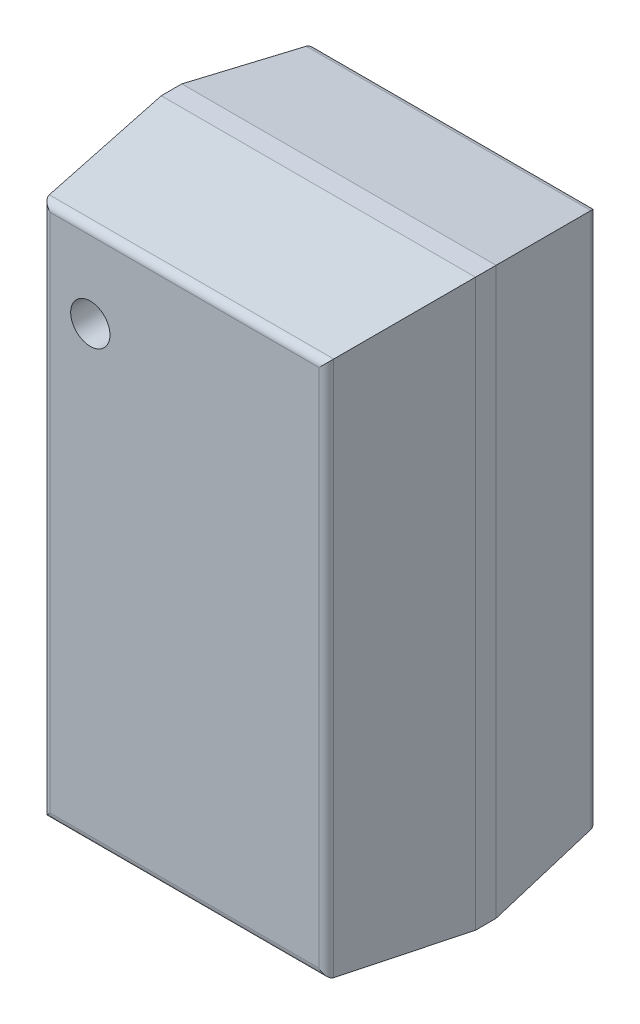
ISO-10303-21;
HEADER;
FILE_DESCRIPTION(('STEP AP214'),'2;1');
FILE_NAME('part.step','',(''),(''),'','','');
FILE_SCHEMA(('AUTOMOTIVE_DESIGN { 1 0 10303 214 1 1 1 1 }'));
ENDSEC;
DATA;
#1=APPLICATION_CONTEXT('core data for automotive mechanical design processes');
#2=APPLICATION_PROTOCOL_DEFINITION('international standard','automotive_design',2000,#1);
#3=PRODUCT_CONTEXT('',#1,'mechanical');
#4=PRODUCT('Part','Part','',(#3));
#5=PRODUCT_RELATED_PRODUCT_CATEGORY('part','',(#4));
#6=PRODUCT_DEFINITION_FORMATION('','',#4);
#7=PRODUCT_DEFINITION_CONTEXT('part definition',#1,'design');
#8=PRODUCT_DEFINITION('design','',#6,#7);
#9=PRODUCT_DEFINITION_SHAPE('','',#8);
#10=(LENGTH_UNIT() NAMED_UNIT(*) SI_UNIT(.MILLI.,.METRE.));
#11=(NAMED_UNIT(*) PLANE_ANGLE_UNIT() SI_UNIT($,.RADIAN.));
#12=(NAMED_UNIT(*) SI_UNIT($,.STERADIAN.) SOLID_ANGLE_UNIT());
#13=UNCERTAINTY_MEASURE_WITH_UNIT(LENGTH_MEASURE(1.E-05),#10,'distance_accuracy_value','');
#14=(GEOMETRIC_REPRESENTATION_CONTEXT(3) GLOBAL_UNCERTAINTY_ASSIGNED_CONTEXT((#13)) GLOBAL_UNIT_ASSIGNED_CONTEXT((#10,
#11,#12)) REPRESENTATION_CONTEXT('',''));
#15=CARTESIAN_POINT('',(0.,0.,0.));
#16=DIRECTION('',(0.,0.,1.));
#17=DIRECTION('',(1.,0.,0.));
#18=AXIS2_PLACEMENT_3D('',#15,#16,#17);
#19=CARTESIAN_POINT('',(-0.4875,0.95,1.305));
#20=DIRECTION('',(0.,0.,1.));
#21=DIRECTION('',(1.,0.,0.));
#22=AXIS2_PLACEMENT_3D('',#19,#20,#21);
#23=PLANE('',#22);
#24=CARTESIAN_POINT('',(-0.4875,0.95,1.305));
#25=DIRECTION('',(0.,0.,1.));
#26=DIRECTION('',(1.,0.,0.));
#27=AXIS2_PLACEMENT_3D('',#24,#25,#26);
#28=CIRCLE('',#27,0.1015625);
#29=CARTESIAN_POINT('',(-0.3859375,0.95,1.305));
#30=VERTEX_POINT('',#29);
#31=EDGE_CURVE('E20',#30,#30,#28,.T.);
#32=ORIENTED_EDGE('',*,*,#31,.T.);
#33=EDGE_LOOP('',(#32));
#34=FACE_BOUND('',#33,.T.);
#35=ADVANCED_FACE('F17',(#34),#23,.T.);
#36=CARTESIAN_POINT('',(-0.4875,0.95,1.305));
#37=DIRECTION('',(0.,0.,1.));
#38=DIRECTION('',(1.,0.,0.));
#39=AXIS2_PLACEMENT_3D('',#36,#37,#38);
#40=CYLINDRICAL_SURFACE('',#39,0.1015625);
#41=CARTESIAN_POINT('',(-0.4875,0.95,1.45));
#42=DIRECTION('',(0.,0.,1.));
#43=DIRECTION('',(1.,0.,0.));
#44=AXIS2_PLACEMENT_3D('',#41,#42,#43);
#45=CIRCLE('',#44,0.1015625);
#46=CARTESIAN_POINT('',(-0.3859375,0.95,1.45));
#47=VERTEX_POINT('',#46);
#48=EDGE_CURVE('E100',#47,#47,#45,.F.);
#49=ORIENTED_EDGE('',*,*,#48,.F.);
#50=EDGE_LOOP('',(#49));
#51=FACE_BOUND('',#50,.T.);
#52=ORIENTED_EDGE('',*,*,#31,.F.);
#53=EDGE_LOOP('',(#52));
#54=FACE_BOUND('',#53,.T.);
#55=ADVANCED_FACE('F496',(#51,#54),#40,.F.);
#56=CARTESIAN_POINT('',(-0.8125,-1.4625,1.45));
#57=DIRECTION('',(0.,0.,1.));
#58=DIRECTION('',(1.,0.,0.));
#59=AXIS2_PLACEMENT_3D('',#56,#57,#58);
#60=PLANE('',#59);
#61=ORIENTED_EDGE('',*,*,#48,.T.);
#62=EDGE_LOOP('',(#61));
#63=FACE_BOUND('',#62,.T.);
#64=DIRECTION('',(0.,1.,0.));
#65=VECTOR('',#64,1.);
#66=CARTESIAN_POINT('',(0.695116313681,-1.38125,1.45));
#67=LINE('',#66,#65);
#68=CARTESIAN_POINT('',(0.695116313681,1.345116313681,1.45));
#69=VERTEX_POINT('',#68);
#70=CARTESIAN_POINT('',(0.695116313681,-1.345116313681,1.45));
#71=VERTEX_POINT('',#70);
#72=EDGE_CURVE('E107',#69,#71,#67,.F.);
#73=ORIENTED_EDGE('',*,*,#72,.F.);
#74=DIRECTION('',(1.,0.,0.));
#75=VECTOR('',#74,1.);
#76=CARTESIAN_POINT('',(-0.8125,1.345116313681,1.45));
#77=LINE('',#76,#75);
#78=CARTESIAN_POINT('',(-0.695116313681,1.345116313681,1.45));
#79=VERTEX_POINT('',#78);
#80=EDGE_CURVE('E96',#69,#79,#77,.F.);
#81=ORIENTED_EDGE('',*,*,#80,.T.);
#82=DIRECTION('',(0.,1.,0.));
#83=VECTOR('',#82,1.);
#84=CARTESIAN_POINT('',(-0.695116313681,-1.38125,1.45));
#85=LINE('',#84,#83);
#86=CARTESIAN_POINT('',(-0.695116313681,-1.345116313681,1.45));
#87=VERTEX_POINT('',#86);
#88=EDGE_CURVE('E92',#87,#79,#85,.T.);
#89=ORIENTED_EDGE('',*,*,#88,.F.);
#90=DIRECTION('',(1.,0.,0.));
#91=VECTOR('',#90,1.);
#92=CARTESIAN_POINT('',(-0.73125,-1.345116313681,1.45));
#93=LINE('',#92,#91);
#94=EDGE_CURVE('E81',#71,#87,#93,.F.);
#95=ORIENTED_EDGE('',*,*,#94,.F.);
#96=EDGE_LOOP('',(#73,#81,#89,#95));
#97=FACE_BOUND('',#96,.T.);
#98=ADVANCED_FACE('F95',(#63,#97),#60,.T.);
#99=CARTESIAN_POINT('',(-0.695116313681,-1.38125,1.409375));
#100=DIRECTION('',(0.,1.,0.));
#101=DIRECTION('',(0.,0.,1.));
#102=AXIS2_PLACEMENT_3D('',#99,#100,#101);
#103=CYLINDRICAL_SURFACE('',#102,0.040625);
#104=CARTESIAN_POINT('',(-0.695116313681,1.345116313681,1.409375));
#105=DIRECTION('',(0.707106781186547,0.707106781186547,0.));
#106=DIRECTION('',(0.707106781186547,-0.707106781186547,0.));
#107=AXIS2_PLACEMENT_3D('',#104,#105,#106);
#108=ELLIPSE('',#107,0.057452425971407,0.040625);
#109=CARTESIAN_POINT('',(-0.735464089736969,1.38546408973693,1.41411288901713));
#110=VERTEX_POINT('',#109);
#111=EDGE_CURVE('E129',#110,#79,#108,.T.);
#112=ORIENTED_EDGE('',*,*,#111,.F.);
#113=DIRECTION('',(0.,1.,0.));
#114=VECTOR('',#113,1.);
#115=CARTESIAN_POINT('',(-0.735464089736921,-1.4625,1.41411288901699));
#116=LINE('',#115,#114);
#117=CARTESIAN_POINT('',(-0.735464089736969,-1.38546408973693,1.41411288901713));
#118=VERTEX_POINT('',#117);
#119=EDGE_CURVE('E104',#110,#118,#116,.F.);
#120=ORIENTED_EDGE('',*,*,#119,.T.);
#121=CARTESIAN_POINT('',(-0.695116313681,-1.345116313681,1.409375));
#122=DIRECTION('',(0.707106781186547,-0.707106781186547,0.));
#123=DIRECTION('',(0.707106781186547,0.707106781186547,0.));
#124=AXIS2_PLACEMENT_3D('',#121,#122,#123);
#125=ELLIPSE('',#124,0.057452425971407,0.040625);
#126=EDGE_CURVE('E86',#87,#118,#125,.T.);
#127=ORIENTED_EDGE('',*,*,#126,.F.);
#128=ORIENTED_EDGE('',*,*,#88,.T.);
#129=EDGE_LOOP('',(#112,#120,#127,#128));
#130=FACE_BOUND('',#129,.T.);
#131=ADVANCED_FACE('F103',(#130),#103,.T.);
#132=CARTESIAN_POINT('',(-0.73125,-1.345116313681,1.409375));
#133=DIRECTION('',(1.,0.,0.));
#134=DIRECTION('',(0.,0.,-1.));
#135=AXIS2_PLACEMENT_3D('',#132,#133,#134);
#136=CYLINDRICAL_SURFACE('',#135,0.040625);
#137=ORIENTED_EDGE('',*,*,#94,.T.);
#138=ORIENTED_EDGE('',*,*,#126,.T.);
#139=DIRECTION('',(1.,0.,0.));
#140=VECTOR('',#139,1.);
#141=CARTESIAN_POINT('',(-0.8125,-1.38546408973692,1.41411288901699));
#142=LINE('',#141,#140);
#143=CARTESIAN_POINT('',(0.735464089736929,-1.38546408973697,1.41411288901713));
#144=VERTEX_POINT('',#143);
#145=EDGE_CURVE('E141',#118,#144,#142,.T.);
#146=ORIENTED_EDGE('',*,*,#145,.T.);
#147=CARTESIAN_POINT('',(0.695116313681,-1.345116313681,1.409375));
#148=DIRECTION('',(0.707106781186547,0.707106781186547,0.));
#149=DIRECTION('',(-0.707106781186547,0.707106781186547,0.));
#150=AXIS2_PLACEMENT_3D('',#147,#148,#149);
#151=ELLIPSE('',#150,0.057452425971407,0.040625);
#152=EDGE_CURVE('E88',#71,#144,#151,.T.);
#153=ORIENTED_EDGE('',*,*,#152,.F.);
#154=EDGE_LOOP('',(#137,#138,#146,#153));
#155=FACE_BOUND('',#154,.T.);
#156=ADVANCED_FACE('F83',(#155),#136,.T.);
#157=CARTESIAN_POINT('',(0.695116313681,-1.38125,1.409375));
#158=DIRECTION('',(0.,1.,0.));
#159=DIRECTION('',(0.,0.,1.));
#160=AXIS2_PLACEMENT_3D('',#157,#158,#159);
#161=CYLINDRICAL_SURFACE('',#160,0.040625);
#162=CARTESIAN_POINT('',(0.695116313681,1.345116313681,1.409375));
#163=DIRECTION('',(0.707106781186547,-0.707106781186547,0.));
#164=DIRECTION('',(0.707106781186547,0.707106781186547,0.));
#165=AXIS2_PLACEMENT_3D('',#162,#163,#164);
#166=ELLIPSE('',#165,0.057452425971407,0.040625);
#167=CARTESIAN_POINT('',(0.735464089736969,1.38546408973693,1.41411288901713));
#168=VERTEX_POINT('',#167);
#169=EDGE_CURVE('E130',#69,#168,#166,.F.);
#170=ORIENTED_EDGE('',*,*,#169,.F.);
#171=ORIENTED_EDGE('',*,*,#72,.T.);
#172=ORIENTED_EDGE('',*,*,#152,.T.);
#173=DIRECTION('',(0.,1.,0.));
#174=VECTOR('',#173,1.);
#175=CARTESIAN_POINT('',(0.735464089736921,-1.4625,1.41411288901699));
#176=LINE('',#175,#174);
#177=EDGE_CURVE('E139',#168,#144,#176,.F.);
#178=ORIENTED_EDGE('',*,*,#177,.F.);
#179=EDGE_LOOP('',(#170,#171,#172,#178));
#180=FACE_BOUND('',#179,.T.);
#181=ADVANCED_FACE('F463',(#180),#161,.T.);
#182=CARTESIAN_POINT('',(-0.73125,1.345116313681,1.409375));
#183=DIRECTION('',(1.,0.,0.));
#184=DIRECTION('',(0.,0.,-1.));
#185=AXIS2_PLACEMENT_3D('',#182,#183,#184);
#186=CYLINDRICAL_SURFACE('',#185,0.040625);
#187=DIRECTION('',(1.,0.,0.));
#188=VECTOR('',#187,1.);
#189=CARTESIAN_POINT('',(-0.8125,1.38546408973692,1.41411288901699));
#190=LINE('',#189,#188);
#191=EDGE_CURVE('E149',#110,#168,#190,.T.);
#192=ORIENTED_EDGE('',*,*,#191,.F.);
#193=ORIENTED_EDGE('',*,*,#111,.T.);
#194=ORIENTED_EDGE('',*,*,#80,.F.);
#195=ORIENTED_EDGE('',*,*,#169,.T.);
#196=EDGE_LOOP('',(#192,#193,#194,#195));
#197=FACE_BOUND('',#196,.T.);
#198=ADVANCED_FACE('F453',(#197),#186,.T.);
#199=CARTESIAN_POINT('',(-0.771875,-1.4625,1.104038244395));
#200=DIRECTION('',(0.993176025992301,0.,-0.116624960425035));
#201=DIRECTION('',(-0.116624960425035,0.,-0.993176025992301));
#202=AXIS2_PLACEMENT_3D('',#199,#200,#201);
#203=PLANE('',#202);
#204=DIRECTION('',(0.115839830265898,-0.115839830265949,0.986489871943916));
#205=VECTOR('',#204,1.);
#206=CARTESIAN_POINT('',(-0.8125,1.46249999999996,0.758076488790995));
#207=LINE('',#206,#205);
#208=CARTESIAN_POINT('',(-0.8125,1.46249999999999,0.758076488790999));
#209=VERTEX_POINT('',#208);
#210=EDGE_CURVE('E155',#209,#110,#207,.T.);
#211=ORIENTED_EDGE('',*,*,#210,.F.);
#212=DIRECTION('',(0.,1.,0.));
#213=VECTOR('',#212,1.);
#214=CARTESIAN_POINT('',(-0.8125,-1.4625,0.758076488791));
#215=LINE('',#214,#213);
#216=CARTESIAN_POINT('',(-0.8125,-1.46249999999999,0.758076488790999));
#217=VERTEX_POINT('',#216);
#218=EDGE_CURVE('E183',#209,#217,#215,.F.);
#219=ORIENTED_EDGE('',*,*,#218,.T.);
#220=DIRECTION('',(0.115839830265898,0.115839830265949,0.986489871943916));
#221=VECTOR('',#220,1.);
#222=CARTESIAN_POINT('',(-0.8125,-1.46249999999996,0.758076488790995));
#223=LINE('',#222,#221);
#224=EDGE_CURVE('E142',#217,#118,#223,.T.);
#225=ORIENTED_EDGE('',*,*,#224,.T.);
#226=ORIENTED_EDGE('',*,*,#119,.F.);
#227=EDGE_LOOP('',(#211,#219,#225,#226));
#228=FACE_BOUND('',#227,.T.);
#229=ADVANCED_FACE('F444',(#228),#203,.F.);
#230=CARTESIAN_POINT('',(-0.8125,-1.421875,1.104038244395));
#231=DIRECTION('',(0.,0.993176025992301,-0.116624960425035));
#232=DIRECTION('',(0.,0.116624960425035,0.993176025992301));
#233=AXIS2_PLACEMENT_3D('',#230,#231,#232);
#234=PLANE('',#233);
#235=DIRECTION('',(1.,0.,0.));
#236=VECTOR('',#235,1.);
#237=CARTESIAN_POINT('',(-0.8125,-1.4625,0.758076488791));
#238=LINE('',#237,#236);
#239=CARTESIAN_POINT('',(0.812499999999989,-1.4625,0.758076488790999));
#240=VERTEX_POINT('',#239);
#241=EDGE_CURVE('E170',#217,#240,#238,.T.);
#242=ORIENTED_EDGE('',*,*,#241,.T.);
#243=DIRECTION('',(0.115839830265948,-0.115839830265898,-0.986489871943916));
#244=VECTOR('',#243,1.);
#245=CARTESIAN_POINT('',(0.735464089736921,-1.385464089737,1.41411288901699));
#246=LINE('',#245,#244);
#247=EDGE_CURVE('E144',#144,#240,#246,.T.);
#248=ORIENTED_EDGE('',*,*,#247,.F.);
#249=ORIENTED_EDGE('',*,*,#145,.F.);
#250=ORIENTED_EDGE('',*,*,#224,.F.);
#251=EDGE_LOOP('',(#242,#248,#249,#250));
#252=FACE_BOUND('',#251,.T.);
#253=ADVANCED_FACE('F435',(#252),#234,.F.);
#254=CARTESIAN_POINT('',(0.771875,-1.4625,1.104038244395));
#255=DIRECTION('',(0.993176025992301,0.,0.116624960425035));
#256=DIRECTION('',(0.116624960425035,0.,-0.993176025992301));
#257=AXIS2_PLACEMENT_3D('',#254,#255,#256);
#258=PLANE('',#257);
#259=DIRECTION('',(0.115839830265898,0.115839830265949,-0.986489871943916));
#260=VECTOR('',#259,1.);
#261=CARTESIAN_POINT('',(0.735464089737001,1.38546408973692,1.41411288901699));
#262=LINE('',#261,#260);
#263=CARTESIAN_POINT('',(0.812500000000001,1.46249999999999,0.758076488790999));
#264=VERTEX_POINT('',#263);
#265=EDGE_CURVE('E150',#168,#264,#262,.T.);
#266=ORIENTED_EDGE('',*,*,#265,.F.);
#267=ORIENTED_EDGE('',*,*,#177,.T.);
#268=ORIENTED_EDGE('',*,*,#247,.T.);
#269=DIRECTION('',(0.,1.,0.));
#270=VECTOR('',#269,1.);
#271=CARTESIAN_POINT('',(0.8125,-1.4625,0.758076488791));
#272=LINE('',#271,#270);
#273=EDGE_CURVE('E180',#264,#240,#272,.F.);
#274=ORIENTED_EDGE('',*,*,#273,.F.);
#275=EDGE_LOOP('',(#266,#267,#268,#274));
#276=FACE_BOUND('',#275,.T.);
#277=ADVANCED_FACE('F426',(#276),#258,.T.);
#278=CARTESIAN_POINT('',(-0.8125,1.421875,1.104038244395));
#279=DIRECTION('',(0.,0.993176025992301,0.116624960425035));
#280=DIRECTION('',(0.,-0.116624960425035,0.993176025992301));
#281=AXIS2_PLACEMENT_3D('',#278,#279,#280);
#282=PLANE('',#281);
#283=DIRECTION('',(1.,0.,0.));
#284=VECTOR('',#283,1.);
#285=CARTESIAN_POINT('',(-0.8125,1.4625,0.758076488791));
#286=LINE('',#285,#284);
#287=EDGE_CURVE('E202',#209,#264,#286,.T.);
#288=ORIENTED_EDGE('',*,*,#287,.F.);
#289=ORIENTED_EDGE('',*,*,#210,.T.);
#290=ORIENTED_EDGE('',*,*,#191,.T.);
#291=ORIENTED_EDGE('',*,*,#265,.T.);
#292=EDGE_LOOP('',(#288,#289,#290,#291));
#293=FACE_BOUND('',#292,.T.);
#294=ADVANCED_FACE('F417',(#293),#282,.T.);
#295=CARTESIAN_POINT('',(-0.8125,-1.4625,0.05));
#296=DIRECTION('',(1.,0.,0.));
#297=DIRECTION('',(0.,0.,-1.));
#298=AXIS2_PLACEMENT_3D('',#295,#296,#297);
#299=PLANE('',#298);
#300=DIRECTION('',(0.,0.,1.));
#301=VECTOR('',#300,1.);
#302=CARTESIAN_POINT('',(-0.8125,1.4625,0.05));
#303=LINE('',#302,#301);
#304=CARTESIAN_POINT('',(-0.81250000000002,1.46250000000006,0.651826488790992));
#305=VERTEX_POINT('',#304);
#306=EDGE_CURVE('E206',#305,#209,#303,.T.);
#307=ORIENTED_EDGE('',*,*,#306,.F.);
#308=DIRECTION('',(0.,1.,0.));
#309=VECTOR('',#308,1.);
#310=CARTESIAN_POINT('',(-0.812500000000081,-1.4625,0.651826488790989));
#311=LINE('',#310,#309);
#312=CARTESIAN_POINT('',(-0.81250000000002,-1.46250000000004,0.651826488790992));
#313=VERTEX_POINT('',#312);
#314=EDGE_CURVE('E205',#313,#305,#311,.T.);
#315=ORIENTED_EDGE('',*,*,#314,.F.);
#316=DIRECTION('',(0.,0.,1.));
#317=VECTOR('',#316,1.);
#318=CARTESIAN_POINT('',(-0.8125,-1.4625,0.05));
#319=LINE('',#318,#317);
#320=EDGE_CURVE('E173',#313,#217,#319,.T.);
#321=ORIENTED_EDGE('',*,*,#320,.T.);
#322=ORIENTED_EDGE('',*,*,#218,.F.);
#323=EDGE_LOOP('',(#307,#315,#321,#322));
#324=FACE_BOUND('',#323,.T.);
#325=ADVANCED_FACE('F407',(#324),#299,.F.);
#326=CARTESIAN_POINT('',(-0.8125,-1.4625,0.05));
#327=DIRECTION('',(0.,1.,0.));
#328=DIRECTION('',(0.,0.,1.));
#329=AXIS2_PLACEMENT_3D('',#326,#327,#328);
#330=PLANE('',#329);
#331=ORIENTED_EDGE('',*,*,#320,.F.);
#332=DIRECTION('',(1.,0.,0.));
#333=VECTOR('',#332,1.);
#334=CARTESIAN_POINT('',(-0.8125,-1.46250000000008,0.651826488790989));
#335=LINE('',#334,#333);
#336=CARTESIAN_POINT('',(0.81250000000004,-1.46250000000002,0.651826488790989));
#337=VERTEX_POINT('',#336);
#338=EDGE_CURVE('E235',#337,#313,#335,.F.);
#339=ORIENTED_EDGE('',*,*,#338,.F.);
#340=DIRECTION('',(0.,0.,-1.));
#341=VECTOR('',#340,1.);
#342=CARTESIAN_POINT('',(0.8125,-1.4625,0.05));
#343=LINE('',#342,#341);
#344=EDGE_CURVE('E172',#240,#337,#343,.T.);
#345=ORIENTED_EDGE('',*,*,#344,.F.);
#346=ORIENTED_EDGE('',*,*,#241,.F.);
#347=EDGE_LOOP('',(#331,#339,#345,#346));
#348=FACE_BOUND('',#347,.T.);
#349=ADVANCED_FACE('F398',(#348),#330,.F.);
#350=CARTESIAN_POINT('',(0.8125,-1.4625,0.05));
#351=DIRECTION('',(1.,0.,0.));
#352=DIRECTION('',(0.,0.,-1.));
#353=AXIS2_PLACEMENT_3D('',#350,#351,#352);
#354=PLANE('',#353);
#355=DIRECTION('',(0.,0.,1.));
#356=VECTOR('',#355,1.);
#357=CARTESIAN_POINT('',(0.8125,1.4625,0.05));
#358=LINE('',#357,#356);
#359=CARTESIAN_POINT('',(0.81250000000002,1.46250000000004,0.651826488790989));
#360=VERTEX_POINT('',#359);
#361=EDGE_CURVE('E210',#264,#360,#358,.F.);
#362=ORIENTED_EDGE('',*,*,#361,.F.);
#363=ORIENTED_EDGE('',*,*,#273,.T.);
#364=ORIENTED_EDGE('',*,*,#344,.T.);
#365=DIRECTION('',(0.,1.,0.));
#366=VECTOR('',#365,1.);
#367=CARTESIAN_POINT('',(0.812500000000081,-1.4625,0.651826488790989));
#368=LINE('',#367,#366);
#369=EDGE_CURVE('E228',#337,#360,#368,.T.);
#370=ORIENTED_EDGE('',*,*,#369,.T.);
#371=EDGE_LOOP('',(#362,#363,#364,#370));
#372=FACE_BOUND('',#371,.T.);
#373=ADVANCED_FACE('F389',(#372),#354,.T.);
#374=CARTESIAN_POINT('',(-0.8125,1.4625,0.05));
#375=DIRECTION('',(0.,1.,0.));
#376=DIRECTION('',(0.,0.,1.));
#377=AXIS2_PLACEMENT_3D('',#374,#375,#376);
#378=PLANE('',#377);
#379=ORIENTED_EDGE('',*,*,#306,.T.);
#380=ORIENTED_EDGE('',*,*,#287,.T.);
#381=ORIENTED_EDGE('',*,*,#361,.T.);
#382=DIRECTION('',(1.,0.,0.));
#383=VECTOR('',#382,1.);
#384=CARTESIAN_POINT('',(-0.8125,1.46250000000008,0.651826488790989));
#385=LINE('',#384,#383);
#386=EDGE_CURVE('E254',#360,#305,#385,.F.);
#387=ORIENTED_EDGE('',*,*,#386,.T.);
#388=EDGE_LOOP('',(#379,#380,#381,#387));
#389=FACE_BOUND('',#388,.T.);
#390=ADVANCED_FACE('F380',(#389),#378,.T.);
#391=CARTESIAN_POINT('',(-0.771875,-1.4625,0.350913244395));
#392=DIRECTION('',(-0.991009446911636,0.,-0.133791913551951));
#393=DIRECTION('',(-0.133791913551951,0.,0.991009446911636));
#394=AXIS2_PLACEMENT_3D('',#391,#392,#393);
#395=PLANE('',#394);
#396=DIRECTION('',(0.132610297441193,-0.132610297440669,-0.982257103830385));
#397=VECTOR('',#396,1.);
#398=CARTESIAN_POINT('',(-0.8125,1.46250000000008,0.651826488790989));
#399=LINE('',#398,#397);
#400=CARTESIAN_POINT('',(-0.736000810181392,1.38600081018168,0.0851897035119067));
#401=VERTEX_POINT('',#400);
#402=EDGE_CURVE('E256',#305,#401,#399,.T.);
#403=ORIENTED_EDGE('',*,*,#402,.T.);
#404=DIRECTION('',(0.,1.,0.));
#405=VECTOR('',#404,1.);
#406=CARTESIAN_POINT('',(-0.736000810181771,-1.38125,0.0851897035118459));
#407=LINE('',#406,#405);
#408=CARTESIAN_POINT('',(-0.736000810181392,-1.38600081018168,0.0851897035119067));
#409=VERTEX_POINT('',#408);
#410=EDGE_CURVE('E128',#409,#401,#407,.T.);
#411=ORIENTED_EDGE('',*,*,#410,.F.);
#412=DIRECTION('',(0.132610297441193,0.132610297440669,-0.982257103830385));
#413=VECTOR('',#412,1.);
#414=CARTESIAN_POINT('',(-0.8125,-1.46250000000008,0.651826488790989));
#415=LINE('',#414,#413);
#416=EDGE_CURVE('E237',#313,#409,#415,.T.);
#417=ORIENTED_EDGE('',*,*,#416,.F.);
#418=ORIENTED_EDGE('',*,*,#314,.T.);
#419=EDGE_LOOP('',(#403,#411,#417,#418));
#420=FACE_BOUND('',#419,.T.);
#421=ADVANCED_FACE('F301',(#420),#395,.T.);
#422=CARTESIAN_POINT('',(-0.8125,-1.421875,0.350913244395));
#423=DIRECTION('',(0.,-0.991009446911636,-0.133791913551951));
#424=DIRECTION('',(0.,0.133791913551951,-0.991009446911636));
#425=AXIS2_PLACEMENT_3D('',#422,#423,#424);
#426=PLANE('',#425);
#427=ORIENTED_EDGE('',*,*,#338,.T.);
#428=ORIENTED_EDGE('',*,*,#416,.T.);
#429=DIRECTION('',(1.,0.,0.));
#430=VECTOR('',#429,1.);
#431=CARTESIAN_POINT('',(-0.73125,-1.38600081018177,0.0851897035118459));
#432=LINE('',#431,#430);
#433=CARTESIAN_POINT('',(0.73600081018168,-1.38600081018139,0.0851897035119068));
#434=VERTEX_POINT('',#433);
#435=EDGE_CURVE('E127',#434,#409,#432,.F.);
#436=ORIENTED_EDGE('',*,*,#435,.F.);
#437=DIRECTION('',(0.132610297440669,-0.132610297441193,0.982257103830385));
#438=VECTOR('',#437,1.);
#439=CARTESIAN_POINT('',(0.736000810181383,-1.386000810181,0.0851897035118983));
#440=LINE('',#439,#438);
#441=EDGE_CURVE('E231',#434,#337,#440,.T.);
#442=ORIENTED_EDGE('',*,*,#441,.T.);
#443=EDGE_LOOP('',(#427,#428,#436,#442));
#444=FACE_BOUND('',#443,.T.);
#445=ADVANCED_FACE('F275',(#444),#426,.T.);
#446=CARTESIAN_POINT('',(0.771875,-1.4625,0.350913244395));
#447=DIRECTION('',(-0.991009446911636,0.,0.133791913551951));
#448=DIRECTION('',(0.133791913551951,0.,0.991009446911636));
#449=AXIS2_PLACEMENT_3D('',#446,#447,#448);
#450=PLANE('',#449);
#451=DIRECTION('',(0.132610297441193,0.132610297440669,0.982257103830385));
#452=VECTOR('',#451,1.);
#453=CARTESIAN_POINT('',(0.736000810181,1.38600081018138,0.0851897035118983));
#454=LINE('',#453,#452);
#455=CARTESIAN_POINT('',(0.736000810181392,1.38600081018168,0.0851897035119067));
#456=VERTEX_POINT('',#455);
#457=EDGE_CURVE('E230',#456,#360,#454,.T.);
#458=ORIENTED_EDGE('',*,*,#457,.T.);
#459=ORIENTED_EDGE('',*,*,#369,.F.);
#460=ORIENTED_EDGE('',*,*,#441,.F.);
#461=DIRECTION('',(0.,1.,0.));
#462=VECTOR('',#461,1.);
#463=CARTESIAN_POINT('',(0.736000810181771,-1.38125,0.0851897035118459));
#464=LINE('',#463,#462);
#465=EDGE_CURVE('E124',#456,#434,#464,.F.);
#466=ORIENTED_EDGE('',*,*,#465,.F.);
#467=EDGE_LOOP('',(#458,#459,#460,#466));
#468=FACE_BOUND('',#467,.T.);
#469=ADVANCED_FACE('F280',(#468),#450,.F.);
#470=CARTESIAN_POINT('',(-0.8125,1.421875,0.350913244395));
#471=DIRECTION('',(0.,-0.991009446911636,0.133791913551951));
#472=DIRECTION('',(0.,-0.133791913551951,-0.991009446911636));
#473=AXIS2_PLACEMENT_3D('',#470,#471,#472);
#474=PLANE('',#473);
#475=ORIENTED_EDGE('',*,*,#386,.F.);
#476=ORIENTED_EDGE('',*,*,#457,.F.);
#477=DIRECTION('',(1.,0.,0.));
#478=VECTOR('',#477,1.);
#479=CARTESIAN_POINT('',(-0.73125,1.38600081018177,0.0851897035118459));
#480=LINE('',#479,#478);
#481=EDGE_CURVE('E118',#401,#456,#480,.T.);
#482=ORIENTED_EDGE('',*,*,#481,.F.);
#483=ORIENTED_EDGE('',*,*,#402,.F.);
#484=EDGE_LOOP('',(#475,#476,#482,#483));
#485=FACE_BOUND('',#484,.T.);
#486=ADVANCED_FACE('F303',(#485),#474,.F.);
#487=CARTESIAN_POINT('',(-0.695741051401,-1.38125,0.090625));
#488=DIRECTION('',(0.,1.,0.));
#489=DIRECTION('',(0.,0.,1.));
#490=AXIS2_PLACEMENT_3D('',#487,#488,#489);
#491=CYLINDRICAL_SURFACE('',#490,0.040625);
#492=DIRECTION('',(0.,1.,0.));
#493=VECTOR('',#492,1.);
#494=CARTESIAN_POINT('',(-0.695741051401,-1.4625,0.05));
#495=LINE('',#494,#493);
#496=CARTESIAN_POINT('',(-0.695741051401,1.345741051401,0.05));
#497=VERTEX_POINT('',#496);
#498=CARTESIAN_POINT('',(-0.695741051401,-1.345741051401,0.05));
#499=VERTEX_POINT('',#498);
#500=EDGE_CURVE('E117',#497,#499,#495,.F.);
#501=ORIENTED_EDGE('',*,*,#500,.T.);
#502=CARTESIAN_POINT('',(-0.695741051401,-1.345741051401,0.090625));
#503=DIRECTION('',(0.707106781186547,-0.707106781186547,0.));
#504=DIRECTION('',(0.707106781186547,0.707106781186547,0.));
#505=AXIS2_PLACEMENT_3D('',#502,#503,#504);
#506=ELLIPSE('',#505,0.057452425971407,0.040625);
#507=EDGE_CURVE('E125',#409,#499,#506,.T.);
#508=ORIENTED_EDGE('',*,*,#507,.F.);
#509=ORIENTED_EDGE('',*,*,#410,.T.);
#510=CARTESIAN_POINT('',(-0.695741051401,1.345741051401,0.090625));
#511=DIRECTION('',(0.707106781186547,0.707106781186547,0.));
#512=DIRECTION('',(0.707106781186547,-0.707106781186547,0.));
#513=AXIS2_PLACEMENT_3D('',#510,#511,#512);
#514=ELLIPSE('',#513,0.057452425971407,0.040625);
#515=EDGE_CURVE('E119',#497,#401,#514,.T.);
#516=ORIENTED_EDGE('',*,*,#515,.F.);
#517=EDGE_LOOP('',(#501,#508,#509,#516));
#518=FACE_BOUND('',#517,.T.);
#519=ADVANCED_FACE('F297',(#518),#491,.T.);
#520=CARTESIAN_POINT('',(-0.73125,-1.345741051401,0.090625));
#521=DIRECTION('',(1.,0.,0.));
#522=DIRECTION('',(0.,0.,-1.));
#523=AXIS2_PLACEMENT_3D('',#520,#521,#522);
#524=CYLINDRICAL_SURFACE('',#523,0.040625);
#525=CARTESIAN_POINT('',(0.695741051401,-1.345741051401,0.090625));
#526=DIRECTION('',(0.707106781186547,0.707106781186547,0.));
#527=DIRECTION('',(-0.707106781186547,0.707106781186547,0.));
#528=AXIS2_PLACEMENT_3D('',#525,#526,#527);
#529=ELLIPSE('',#528,0.057452425971407,0.040625);
#530=CARTESIAN_POINT('',(0.695741051401,-1.345741051401,0.05));
#531=VERTEX_POINT('',#530);
#532=EDGE_CURVE('E122',#434,#531,#529,.T.);
#533=ORIENTED_EDGE('',*,*,#532,.F.);
#534=ORIENTED_EDGE('',*,*,#435,.T.);
#535=ORIENTED_EDGE('',*,*,#507,.T.);
#536=DIRECTION('',(1.,0.,0.));
#537=VECTOR('',#536,1.);
#538=CARTESIAN_POINT('',(-0.8125,-1.345741051401,0.05));
#539=LINE('',#538,#537);
#540=EDGE_CURVE('E289',#499,#531,#539,.T.);
#541=ORIENTED_EDGE('',*,*,#540,.T.);
#542=EDGE_LOOP('',(#533,#534,#535,#541));
#543=FACE_BOUND('',#542,.T.);
#544=ADVANCED_FACE('F310',(#543),#524,.T.);
#545=CARTESIAN_POINT('',(0.695741051401,-1.38125,0.090625));
#546=DIRECTION('',(0.,1.,0.));
#547=DIRECTION('',(0.,0.,1.));
#548=AXIS2_PLACEMENT_3D('',#545,#546,#547);
#549=CYLINDRICAL_SURFACE('',#548,0.040625);
#550=ORIENTED_EDGE('',*,*,#465,.T.);
#551=ORIENTED_EDGE('',*,*,#532,.T.);
#552=DIRECTION('',(0.,1.,0.));
#553=VECTOR('',#552,1.);
#554=CARTESIAN_POINT('',(0.695741051401,-1.4625,0.05));
#555=LINE('',#554,#553);
#556=CARTESIAN_POINT('',(0.695741051401,1.345741051401,0.05));
#557=VERTEX_POINT('',#556);
#558=EDGE_CURVE('E26',#531,#557,#555,.T.);
#559=ORIENTED_EDGE('',*,*,#558,.T.);
#560=CARTESIAN_POINT('',(0.695741051401,1.345741051401,0.090625));
#561=DIRECTION('',(0.707106781186547,-0.707106781186547,0.));
#562=DIRECTION('',(0.707106781186547,0.707106781186547,0.));
#563=AXIS2_PLACEMENT_3D('',#560,#561,#562);
#564=ELLIPSE('',#563,0.057452425971407,0.040625);
#565=EDGE_CURVE('E34',#456,#557,#564,.F.);
#566=ORIENTED_EDGE('',*,*,#565,.F.);
#567=EDGE_LOOP('',(#550,#551,#559,#566));
#568=FACE_BOUND('',#567,.T.);
#569=ADVANCED_FACE('F282',(#568),#549,.T.);
#570=CARTESIAN_POINT('',(-0.73125,1.345741051401,0.090625));
#571=DIRECTION('',(1.,0.,0.));
#572=DIRECTION('',(0.,0.,-1.));
#573=AXIS2_PLACEMENT_3D('',#570,#571,#572);
#574=CYLINDRICAL_SURFACE('',#573,0.040625);
#575=ORIENTED_EDGE('',*,*,#565,.T.);
#576=DIRECTION('',(1.,0.,0.));
#577=VECTOR('',#576,1.);
#578=CARTESIAN_POINT('',(-0.8125,1.345741051401,0.05));
#579=LINE('',#578,#577);
#580=EDGE_CURVE('E11',#557,#497,#579,.F.);
#581=ORIENTED_EDGE('',*,*,#580,.T.);
#582=ORIENTED_EDGE('',*,*,#515,.T.);
#583=ORIENTED_EDGE('',*,*,#481,.T.);
#584=EDGE_LOOP('',(#575,#581,#582,#583));
#585=FACE_BOUND('',#584,.T.);
#586=ADVANCED_FACE('F298',(#585),#574,.T.);
#587=CARTESIAN_POINT('',(-0.8125,-1.4625,0.05));
#588=DIRECTION('',(0.,0.,1.));
#589=DIRECTION('',(1.,0.,0.));
#590=AXIS2_PLACEMENT_3D('',#587,#588,#589);
#591=PLANE('',#590);
#592=ORIENTED_EDGE('',*,*,#558,.F.);
#593=ORIENTED_EDGE('',*,*,#540,.F.);
#594=ORIENTED_EDGE('',*,*,#500,.F.);
#595=ORIENTED_EDGE('',*,*,#580,.F.);
#596=EDGE_LOOP('',(#592,#593,#594,#595));
#597=FACE_BOUND('',#596,.T.);
#598=ADVANCED_FACE('F308',(#597),#591,.F.);
#599=CLOSED_SHELL('',(#35,#55,#98,#131,#156,#181,#198,#229,#253,#277,#294,#325,#349,#373,#390,
#421,#445,#469,#486,#519,#544,#569,#586,#598));
#600=MANIFOLD_SOLID_BREP('B1',#599);
#601=ADVANCED_BREP_SHAPE_REPRESENTATION('',(#18,#600),#14);
#602=SHAPE_DEFINITION_REPRESENTATION(#9,#601);
ENDSEC;
END-ISO-10303-21;
